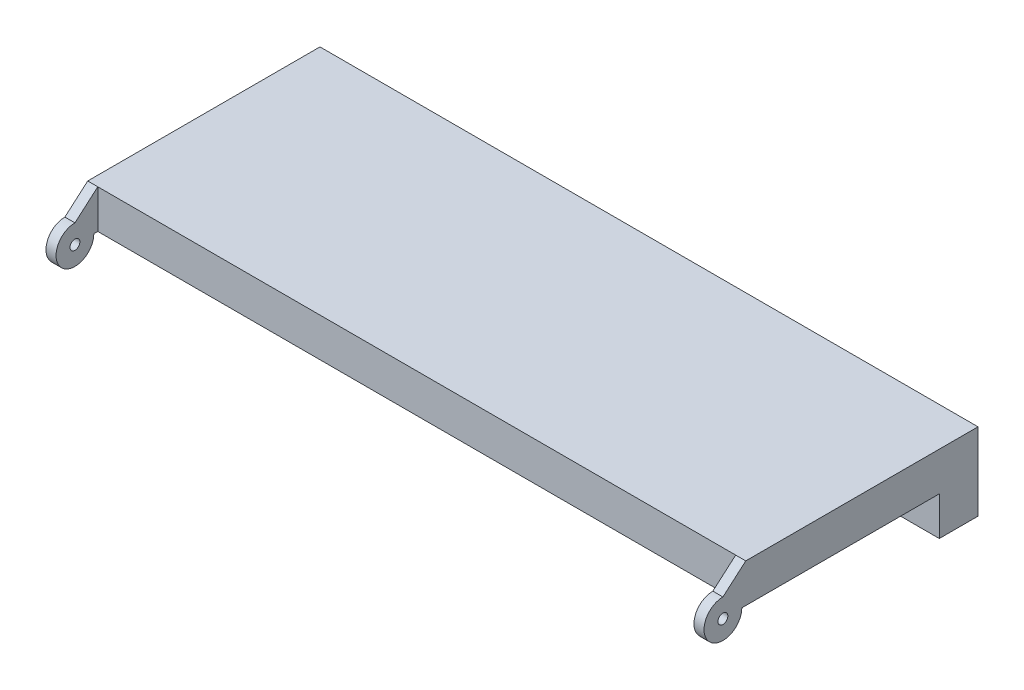
ISO-10303-21;
HEADER;
FILE_DESCRIPTION(('STEP AP214'),'2;1');
FILE_NAME('part.step','',(''),(''),'','','');
FILE_SCHEMA(('AUTOMOTIVE_DESIGN { 1 0 10303 214 1 1 1 1 }'));
ENDSEC;
DATA;
#1=APPLICATION_CONTEXT('core data for automotive mechanical design processes');
#2=APPLICATION_PROTOCOL_DEFINITION('international standard','automotive_design',2000,#1);
#3=PRODUCT_CONTEXT('',#1,'mechanical');
#4=PRODUCT('Part','Part','',(#3));
#5=PRODUCT_RELATED_PRODUCT_CATEGORY('part','',(#4));
#6=PRODUCT_DEFINITION_FORMATION('','',#4);
#7=PRODUCT_DEFINITION_CONTEXT('part definition',#1,'design');
#8=PRODUCT_DEFINITION('design','',#6,#7);
#9=PRODUCT_DEFINITION_SHAPE('','',#8);
#10=(LENGTH_UNIT() NAMED_UNIT(*) SI_UNIT(.MILLI.,.METRE.));
#11=(NAMED_UNIT(*) PLANE_ANGLE_UNIT() SI_UNIT($,.RADIAN.));
#12=(NAMED_UNIT(*) SI_UNIT($,.STERADIAN.) SOLID_ANGLE_UNIT());
#13=UNCERTAINTY_MEASURE_WITH_UNIT(LENGTH_MEASURE(1.E-05),#10,'distance_accuracy_value','');
#14=(GEOMETRIC_REPRESENTATION_CONTEXT(3) GLOBAL_UNCERTAINTY_ASSIGNED_CONTEXT((#13)) GLOBAL_UNIT_ASSIGNED_CONTEXT((#10,
#11,#12)) REPRESENTATION_CONTEXT('',''));
#15=CARTESIAN_POINT('',(0.,0.,0.));
#16=DIRECTION('',(0.,0.,1.));
#17=DIRECTION('',(1.,0.,0.));
#18=AXIS2_PLACEMENT_3D('',#15,#16,#17);
#19=CARTESIAN_POINT('',(0.,10.,0.));
#20=DIRECTION('',(0.,0.,-1.));
#21=DIRECTION('',(-1.,0.,0.));
#22=AXIS2_PLACEMENT_3D('',#19,#20,#21);
#23=PLANE('',#22);
#24=DIRECTION('',(-1.,0.,0.));
#25=VECTOR('',#24,1.);
#26=CARTESIAN_POINT('',(85.,5.,0.));
#27=LINE('',#26,#25);
#28=CARTESIAN_POINT('',(83.7,5.,0.));
#29=VERTEX_POINT('',#28);
#30=CARTESIAN_POINT('',(1.3,5.,0.));
#31=VERTEX_POINT('',#30);
#32=EDGE_CURVE('E60',#29,#31,#27,.T.);
#33=ORIENTED_EDGE('',*,*,#32,.F.);
#34=DIRECTION('',(0.,1.,0.));
#35=VECTOR('',#34,1.);
#36=CARTESIAN_POINT('',(83.7,0.,0.));
#37=LINE('',#36,#35);
#38=CARTESIAN_POINT('',(83.7,10.,0.));
#39=VERTEX_POINT('',#38);
#40=EDGE_CURVE('E158',#29,#39,#37,.T.);
#41=ORIENTED_EDGE('',*,*,#40,.T.);
#42=DIRECTION('',(1.,0.,0.));
#43=VECTOR('',#42,1.);
#44=CARTESIAN_POINT('',(0.,10.,0.));
#45=LINE('',#44,#43);
#46=CARTESIAN_POINT('',(1.3,10.,0.));
#47=VERTEX_POINT('',#46);
#48=EDGE_CURVE('E237',#47,#39,#45,.T.);
#49=ORIENTED_EDGE('',*,*,#48,.F.);
#50=DIRECTION('',(0.,1.,0.));
#51=VECTOR('',#50,1.);
#52=CARTESIAN_POINT('',(1.3,0.,0.));
#53=LINE('',#52,#51);
#54=EDGE_CURVE('E193',#31,#47,#53,.T.);
#55=ORIENTED_EDGE('',*,*,#54,.F.);
#56=EDGE_LOOP('',(#33,#41,#49,#55));
#57=FACE_BOUND('',#56,.T.);
#58=ADVANCED_FACE('F39',(#57),#23,.F.);
#59=CARTESIAN_POINT('',(0.,10.,0.));
#60=DIRECTION('',(1.,0.,0.));
#61=DIRECTION('',(0.,0.,-1.));
#62=AXIS2_PLACEMENT_3D('',#59,#60,#61);
#63=PLANE('',#62);
#64=DIRECTION('',(0.,0.,1.));
#65=VECTOR('',#64,1.);
#66=CARTESIAN_POINT('',(0.,0.,0.));
#67=LINE('',#66,#65);
#68=CARTESIAN_POINT('',(0.,0.,-30.));
#69=VERTEX_POINT('',#68);
#70=CARTESIAN_POINT('',(0.,0.,-25.));
#71=VERTEX_POINT('',#70);
#72=EDGE_CURVE('E229',#69,#71,#67,.T.);
#73=ORIENTED_EDGE('',*,*,#72,.T.);
#74=DIRECTION('',(0.,-1.,0.));
#75=VECTOR('',#74,1.);
#76=CARTESIAN_POINT('',(0.,0.,-25.));
#77=LINE('',#76,#75);
#78=CARTESIAN_POINT('',(0.,5.,-25.));
#79=VERTEX_POINT('',#78);
#80=EDGE_CURVE('E134',#79,#71,#77,.T.);
#81=ORIENTED_EDGE('',*,*,#80,.F.);
#82=DIRECTION('',(0.,0.,-1.));
#83=VECTOR('',#82,1.);
#84=CARTESIAN_POINT('',(0.,5.,0.));
#85=LINE('',#84,#83);
#86=CARTESIAN_POINT('',(0.,5.,0.51));
#87=VERTEX_POINT('',#86);
#88=EDGE_CURVE('E215',#87,#79,#85,.T.);
#89=ORIENTED_EDGE('',*,*,#88,.F.);
#90=CARTESIAN_POINT('',(0.,5.,2.95));
#91=DIRECTION('',(-1.,0.,0.));
#92=DIRECTION('',(0.,0.,1.));
#93=AXIS2_PLACEMENT_3D('',#90,#91,#92);
#94=CIRCLE('',#93,2.44);
#95=CARTESIAN_POINT('',(0.,7.44,2.95));
#96=VERTEX_POINT('',#95);
#97=EDGE_CURVE('E178',#87,#96,#94,.T.);
#98=ORIENTED_EDGE('',*,*,#97,.T.);
#99=DIRECTION('',(0.,0.655417754811199,-0.755266553395718));
#100=VECTOR('',#99,1.);
#101=CARTESIAN_POINT('',(0.,5.70427566678247,4.95015108710614));
#102=LINE('',#101,#100);
#103=CARTESIAN_POINT('',(0.,10.,0.));
#104=VERTEX_POINT('',#103);
#105=EDGE_CURVE('E205',#96,#104,#102,.T.);
#106=ORIENTED_EDGE('',*,*,#105,.T.);
#107=DIRECTION('',(0.,0.,1.));
#108=VECTOR('',#107,1.);
#109=CARTESIAN_POINT('',(0.,10.,0.));
#110=LINE('',#109,#108);
#111=CARTESIAN_POINT('',(0.,10.,-30.));
#112=VERTEX_POINT('',#111);
#113=EDGE_CURVE('E234',#112,#104,#110,.T.);
#114=ORIENTED_EDGE('',*,*,#113,.F.);
#115=DIRECTION('',(0.,-1.,0.));
#116=VECTOR('',#115,1.);
#117=CARTESIAN_POINT('',(0.,10.,-30.));
#118=LINE('',#117,#116);
#119=EDGE_CURVE('E48',#112,#69,#118,.T.);
#120=ORIENTED_EDGE('',*,*,#119,.T.);
#121=EDGE_LOOP('',(#73,#81,#89,#98,#106,#114,#120));
#122=FACE_BOUND('',#121,.T.);
#123=CARTESIAN_POINT('',(0.,5.,2.95));
#124=DIRECTION('',(-1.,0.,0.));
#125=DIRECTION('',(0.,0.,1.));
#126=AXIS2_PLACEMENT_3D('',#123,#124,#125);
#127=CIRCLE('',#126,0.64);
#128=CARTESIAN_POINT('',(0.,5.,3.59));
#129=VERTEX_POINT('',#128);
#130=EDGE_CURVE('E185',#129,#129,#127,.T.);
#131=ORIENTED_EDGE('',*,*,#130,.F.);
#132=EDGE_LOOP('',(#131));
#133=FACE_BOUND('',#132,.T.);
#134=ADVANCED_FACE('F41',(#122,#133),#63,.F.);
#135=CARTESIAN_POINT('',(85.,10.,0.));
#136=DIRECTION('',(-1.,0.,0.));
#137=DIRECTION('',(0.,0.,1.));
#138=AXIS2_PLACEMENT_3D('',#135,#136,#137);
#139=PLANE('',#138);
#140=DIRECTION('',(0.,0.,-1.));
#141=VECTOR('',#140,1.);
#142=CARTESIAN_POINT('',(85.,5.,0.));
#143=LINE('',#142,#141);
#144=CARTESIAN_POINT('',(85.,5.,0.51));
#145=VERTEX_POINT('',#144);
#146=CARTESIAN_POINT('',(85.,5.,-25.));
#147=VERTEX_POINT('',#146);
#148=EDGE_CURVE('E121',#145,#147,#143,.T.);
#149=ORIENTED_EDGE('',*,*,#148,.T.);
#150=DIRECTION('',(0.,-1.,0.));
#151=VECTOR('',#150,1.);
#152=CARTESIAN_POINT('',(85.,0.,-25.));
#153=LINE('',#152,#151);
#154=CARTESIAN_POINT('',(85.,0.,-25.));
#155=VERTEX_POINT('',#154);
#156=EDGE_CURVE('E133',#147,#155,#153,.T.);
#157=ORIENTED_EDGE('',*,*,#156,.T.);
#158=DIRECTION('',(0.,0.,-1.));
#159=VECTOR('',#158,1.);
#160=CARTESIAN_POINT('',(85.,0.,0.));
#161=LINE('',#160,#159);
#162=CARTESIAN_POINT('',(85.,0.,-30.));
#163=VERTEX_POINT('',#162);
#164=EDGE_CURVE('E251',#155,#163,#161,.T.);
#165=ORIENTED_EDGE('',*,*,#164,.T.);
#166=DIRECTION('',(0.,-1.,0.));
#167=VECTOR('',#166,1.);
#168=CARTESIAN_POINT('',(85.,10.,-30.));
#169=LINE('',#168,#167);
#170=CARTESIAN_POINT('',(85.,10.,-30.));
#171=VERTEX_POINT('',#170);
#172=EDGE_CURVE('E11',#171,#163,#169,.T.);
#173=ORIENTED_EDGE('',*,*,#172,.F.);
#174=DIRECTION('',(0.,0.,-1.));
#175=VECTOR('',#174,1.);
#176=CARTESIAN_POINT('',(85.,10.,0.));
#177=LINE('',#176,#175);
#178=CARTESIAN_POINT('',(85.,10.,0.));
#179=VERTEX_POINT('',#178);
#180=EDGE_CURVE('E242',#179,#171,#177,.T.);
#181=ORIENTED_EDGE('',*,*,#180,.F.);
#182=DIRECTION('',(0.,0.655417754811199,-0.755266553395718));
#183=VECTOR('',#182,1.);
#184=CARTESIAN_POINT('',(85.,5.70427566678247,4.95015108710614));
#185=LINE('',#184,#183);
#186=CARTESIAN_POINT('',(85.,7.44,2.95));
#187=VERTEX_POINT('',#186);
#188=EDGE_CURVE('E150',#187,#179,#185,.T.);
#189=ORIENTED_EDGE('',*,*,#188,.F.);
#190=CARTESIAN_POINT('',(85.,5.,2.95));
#191=DIRECTION('',(-1.,0.,0.));
#192=DIRECTION('',(0.,0.,1.));
#193=AXIS2_PLACEMENT_3D('',#190,#191,#192);
#194=CIRCLE('',#193,2.44);
#195=EDGE_CURVE('E139',#145,#187,#194,.T.);
#196=ORIENTED_EDGE('',*,*,#195,.F.);
#197=EDGE_LOOP('',(#149,#157,#165,#173,#181,#189,#196));
#198=FACE_BOUND('',#197,.T.);
#199=CARTESIAN_POINT('',(85.,5.,2.95));
#200=DIRECTION('',(-1.,0.,0.));
#201=DIRECTION('',(0.,0.,1.));
#202=AXIS2_PLACEMENT_3D('',#199,#200,#201);
#203=CIRCLE('',#202,0.64);
#204=CARTESIAN_POINT('',(85.,5.,3.59));
#205=VERTEX_POINT('',#204);
#206=EDGE_CURVE('E144',#205,#205,#203,.T.);
#207=ORIENTED_EDGE('',*,*,#206,.T.);
#208=EDGE_LOOP('',(#207));
#209=FACE_BOUND('',#208,.T.);
#210=ADVANCED_FACE('F147',(#198,#209),#139,.F.);
#211=CARTESIAN_POINT('',(0.,10.,-30.));
#212=DIRECTION('',(0.,0.,1.));
#213=DIRECTION('',(1.,0.,0.));
#214=AXIS2_PLACEMENT_3D('',#211,#212,#213);
#215=PLANE('',#214);
#216=DIRECTION('',(-1.,0.,0.));
#217=VECTOR('',#216,1.);
#218=CARTESIAN_POINT('',(0.,0.,-30.));
#219=LINE('',#218,#217);
#220=EDGE_CURVE('E238',#163,#69,#219,.T.);
#221=ORIENTED_EDGE('',*,*,#220,.T.);
#222=ORIENTED_EDGE('',*,*,#119,.F.);
#223=DIRECTION('',(-1.,0.,0.));
#224=VECTOR('',#223,1.);
#225=CARTESIAN_POINT('',(0.,10.,-30.));
#226=LINE('',#225,#224);
#227=EDGE_CURVE('E245',#171,#112,#226,.T.);
#228=ORIENTED_EDGE('',*,*,#227,.F.);
#229=ORIENTED_EDGE('',*,*,#172,.T.);
#230=EDGE_LOOP('',(#221,#222,#228,#229));
#231=FACE_BOUND('',#230,.T.);
#232=ADVANCED_FACE('F272',(#231),#215,.F.);
#233=CARTESIAN_POINT('',(0.,10.,0.));
#234=DIRECTION('',(0.,-1.,0.));
#235=DIRECTION('',(0.,0.,-1.));
#236=AXIS2_PLACEMENT_3D('',#233,#234,#235);
#237=PLANE('',#236);
#238=ORIENTED_EDGE('',*,*,#113,.T.);
#239=EDGE_CURVE('E239',#104,#47,#45,.T.);
#240=ORIENTED_EDGE('',*,*,#239,.T.);
#241=ORIENTED_EDGE('',*,*,#48,.T.);
#242=DIRECTION('',(-1.,0.,0.));
#243=VECTOR('',#242,1.);
#244=CARTESIAN_POINT('',(85.,10.,0.));
#245=LINE('',#244,#243);
#246=EDGE_CURVE('E175',#179,#39,#245,.T.);
#247=ORIENTED_EDGE('',*,*,#246,.F.);
#248=ORIENTED_EDGE('',*,*,#180,.T.);
#249=ORIENTED_EDGE('',*,*,#227,.T.);
#250=EDGE_LOOP('',(#238,#240,#241,#247,#248,#249));
#251=FACE_BOUND('',#250,.T.);
#252=ADVANCED_FACE('F274',(#251),#237,.F.);
#253=CARTESIAN_POINT('',(0.,0.,0.));
#254=DIRECTION('',(0.,-1.,0.));
#255=DIRECTION('',(0.,0.,-1.));
#256=AXIS2_PLACEMENT_3D('',#253,#254,#255);
#257=PLANE('',#256);
#258=DIRECTION('',(-1.,0.,0.));
#259=VECTOR('',#258,1.);
#260=CARTESIAN_POINT('',(85.,0.,-25.));
#261=LINE('',#260,#259);
#262=EDGE_CURVE('E225',#155,#71,#261,.T.);
#263=ORIENTED_EDGE('',*,*,#262,.T.);
#264=ORIENTED_EDGE('',*,*,#72,.F.);
#265=ORIENTED_EDGE('',*,*,#220,.F.);
#266=ORIENTED_EDGE('',*,*,#164,.F.);
#267=EDGE_LOOP('',(#263,#264,#265,#266));
#268=FACE_BOUND('',#267,.T.);
#269=ADVANCED_FACE('F267',(#268),#257,.T.);
#270=CARTESIAN_POINT('',(85.,0.,-25.));
#271=DIRECTION('',(0.,0.,-1.));
#272=DIRECTION('',(-1.,0.,0.));
#273=AXIS2_PLACEMENT_3D('',#270,#271,#272);
#274=PLANE('',#273);
#275=ORIENTED_EDGE('',*,*,#80,.T.);
#276=ORIENTED_EDGE('',*,*,#262,.F.);
#277=ORIENTED_EDGE('',*,*,#156,.F.);
#278=DIRECTION('',(-1.,0.,0.));
#279=VECTOR('',#278,1.);
#280=CARTESIAN_POINT('',(85.,5.,-25.));
#281=LINE('',#280,#279);
#282=EDGE_CURVE('E127',#147,#79,#281,.T.);
#283=ORIENTED_EDGE('',*,*,#282,.T.);
#284=EDGE_LOOP('',(#275,#276,#277,#283));
#285=FACE_BOUND('',#284,.T.);
#286=ADVANCED_FACE('F270',(#285),#274,.F.);
#287=CARTESIAN_POINT('',(85.,5.,0.));
#288=DIRECTION('',(0.,1.,0.));
#289=DIRECTION('',(0.,0.,1.));
#290=AXIS2_PLACEMENT_3D('',#287,#288,#289);
#291=PLANE('',#290);
#292=ORIENTED_EDGE('',*,*,#88,.T.);
#293=ORIENTED_EDGE('',*,*,#282,.F.);
#294=ORIENTED_EDGE('',*,*,#148,.F.);
#295=DIRECTION('',(-1.,0.,0.));
#296=VECTOR('',#295,1.);
#297=CARTESIAN_POINT('',(85.,5.,0.51));
#298=LINE('',#297,#296);
#299=CARTESIAN_POINT('',(83.7,5.,0.51));
#300=VERTEX_POINT('',#299);
#301=EDGE_CURVE('E125',#145,#300,#298,.T.);
#302=ORIENTED_EDGE('',*,*,#301,.T.);
#303=DIRECTION('',(0.,0.,1.));
#304=VECTOR('',#303,1.);
#305=CARTESIAN_POINT('',(83.7,5.,0.));
#306=LINE('',#305,#304);
#307=EDGE_CURVE('E55',#29,#300,#306,.T.);
#308=ORIENTED_EDGE('',*,*,#307,.F.);
#309=ORIENTED_EDGE('',*,*,#32,.T.);
#310=DIRECTION('',(0.,0.,1.));
#311=VECTOR('',#310,1.);
#312=CARTESIAN_POINT('',(1.3,5.,0.));
#313=LINE('',#312,#311);
#314=CARTESIAN_POINT('',(1.3,5.,0.51));
#315=VERTEX_POINT('',#314);
#316=EDGE_CURVE('E181',#31,#315,#313,.T.);
#317=ORIENTED_EDGE('',*,*,#316,.T.);
#318=DIRECTION('',(-1.,0.,0.));
#319=VECTOR('',#318,1.);
#320=CARTESIAN_POINT('',(1.3,5.,0.51));
#321=LINE('',#320,#319);
#322=EDGE_CURVE('E201',#315,#87,#321,.T.);
#323=ORIENTED_EDGE('',*,*,#322,.T.);
#324=EDGE_LOOP('',(#292,#293,#294,#302,#308,#309,#317,#323));
#325=FACE_BOUND('',#324,.T.);
#326=ADVANCED_FACE('F124',(#325),#291,.F.);
#327=CARTESIAN_POINT('',(1.3,5.70427566678247,4.95015108710614));
#328=DIRECTION('',(0.,0.755266553395718,0.655417754811199));
#329=DIRECTION('',(0.,-0.655417754811199,0.755266553395718));
#330=AXIS2_PLACEMENT_3D('',#327,#328,#329);
#331=PLANE('',#330);
#332=ORIENTED_EDGE('',*,*,#105,.F.);
#333=DIRECTION('',(-1.,0.,0.));
#334=VECTOR('',#333,1.);
#335=CARTESIAN_POINT('',(1.3,7.44,2.95));
#336=LINE('',#335,#334);
#337=CARTESIAN_POINT('',(1.3,7.44,2.95));
#338=VERTEX_POINT('',#337);
#339=EDGE_CURVE('E212',#338,#96,#336,.T.);
#340=ORIENTED_EDGE('',*,*,#339,.F.);
#341=DIRECTION('',(0.,0.655417754811199,-0.755266553395718));
#342=VECTOR('',#341,1.);
#343=CARTESIAN_POINT('',(1.3,5.70427566678247,4.95015108710614));
#344=LINE('',#343,#342);
#345=EDGE_CURVE('E189',#338,#47,#344,.T.);
#346=ORIENTED_EDGE('',*,*,#345,.T.);
#347=ORIENTED_EDGE('',*,*,#239,.F.);
#348=EDGE_LOOP('',(#332,#340,#346,#347));
#349=FACE_BOUND('',#348,.T.);
#350=ADVANCED_FACE('F297',(#349),#331,.T.);
#351=CARTESIAN_POINT('',(1.3,5.,2.95));
#352=DIRECTION('',(-1.,0.,0.));
#353=DIRECTION('',(0.,0.,1.));
#354=AXIS2_PLACEMENT_3D('',#351,#352,#353);
#355=CYLINDRICAL_SURFACE('',#354,2.44);
#356=ORIENTED_EDGE('',*,*,#97,.F.);
#357=ORIENTED_EDGE('',*,*,#322,.F.);
#358=CARTESIAN_POINT('',(1.3,5.,2.95));
#359=DIRECTION('',(-1.,0.,0.));
#360=DIRECTION('',(0.,0.,1.));
#361=AXIS2_PLACEMENT_3D('',#358,#359,#360);
#362=CIRCLE('',#361,2.44);
#363=EDGE_CURVE('E184',#315,#338,#362,.T.);
#364=ORIENTED_EDGE('',*,*,#363,.T.);
#365=ORIENTED_EDGE('',*,*,#339,.T.);
#366=EDGE_LOOP('',(#356,#357,#364,#365));
#367=FACE_BOUND('',#366,.T.);
#368=ADVANCED_FACE('F294',(#367),#355,.T.);
#369=CARTESIAN_POINT('',(1.3,5.,2.95));
#370=DIRECTION('',(-1.,0.,0.));
#371=DIRECTION('',(0.,0.,1.));
#372=AXIS2_PLACEMENT_3D('',#369,#370,#371);
#373=CYLINDRICAL_SURFACE('',#372,0.64);
#374=CARTESIAN_POINT('',(1.3,5.,2.95));
#375=DIRECTION('',(-1.,0.,0.));
#376=DIRECTION('',(0.,0.,1.));
#377=AXIS2_PLACEMENT_3D('',#374,#375,#376);
#378=CIRCLE('',#377,0.64);
#379=CARTESIAN_POINT('',(1.3,5.,3.59));
#380=VERTEX_POINT('',#379);
#381=EDGE_CURVE('E197',#380,#380,#378,.T.);
#382=ORIENTED_EDGE('',*,*,#381,.F.);
#383=EDGE_LOOP('',(#382));
#384=FACE_BOUND('',#383,.T.);
#385=ORIENTED_EDGE('',*,*,#130,.T.);
#386=EDGE_LOOP('',(#385));
#387=FACE_BOUND('',#386,.T.);
#388=ADVANCED_FACE('F304',(#384,#387),#373,.F.);
#389=CARTESIAN_POINT('',(1.3,0.,0.));
#390=DIRECTION('',(-1.,0.,0.));
#391=DIRECTION('',(0.,0.,1.));
#392=AXIS2_PLACEMENT_3D('',#389,#390,#391);
#393=PLANE('',#392);
#394=ORIENTED_EDGE('',*,*,#316,.F.);
#395=ORIENTED_EDGE('',*,*,#54,.T.);
#396=ORIENTED_EDGE('',*,*,#345,.F.);
#397=ORIENTED_EDGE('',*,*,#363,.F.);
#398=EDGE_LOOP('',(#394,#395,#396,#397));
#399=FACE_BOUND('',#398,.T.);
#400=ORIENTED_EDGE('',*,*,#381,.T.);
#401=EDGE_LOOP('',(#400));
#402=FACE_BOUND('',#401,.T.);
#403=ADVANCED_FACE('F290',(#399,#402),#393,.F.);
#404=CARTESIAN_POINT('',(85.,5.70427566678247,4.95015108710614));
#405=DIRECTION('',(0.,0.755266553395718,0.655417754811199));
#406=DIRECTION('',(0.,-0.655417754811199,0.755266553395718));
#407=AXIS2_PLACEMENT_3D('',#404,#405,#406);
#408=PLANE('',#407);
#409=DIRECTION('',(0.,0.655417754811199,-0.755266553395718));
#410=VECTOR('',#409,1.);
#411=CARTESIAN_POINT('',(83.7,5.70427566678247,4.95015108710614));
#412=LINE('',#411,#410);
#413=CARTESIAN_POINT('',(83.7,7.44,2.95));
#414=VERTEX_POINT('',#413);
#415=EDGE_CURVE('E168',#414,#39,#412,.T.);
#416=ORIENTED_EDGE('',*,*,#415,.F.);
#417=DIRECTION('',(-1.,0.,0.));
#418=VECTOR('',#417,1.);
#419=CARTESIAN_POINT('',(85.,7.44,2.95));
#420=LINE('',#419,#418);
#421=EDGE_CURVE('E143',#187,#414,#420,.T.);
#422=ORIENTED_EDGE('',*,*,#421,.F.);
#423=ORIENTED_EDGE('',*,*,#188,.T.);
#424=ORIENTED_EDGE('',*,*,#246,.T.);
#425=EDGE_LOOP('',(#416,#422,#423,#424));
#426=FACE_BOUND('',#425,.T.);
#427=ADVANCED_FACE('F281',(#426),#408,.T.);
#428=CARTESIAN_POINT('',(85.,5.,2.95));
#429=DIRECTION('',(-1.,0.,0.));
#430=DIRECTION('',(0.,0.,1.));
#431=AXIS2_PLACEMENT_3D('',#428,#429,#430);
#432=CYLINDRICAL_SURFACE('',#431,2.44);
#433=CARTESIAN_POINT('',(83.7,5.,2.95));
#434=DIRECTION('',(-1.,0.,0.));
#435=DIRECTION('',(0.,0.,1.));
#436=AXIS2_PLACEMENT_3D('',#433,#434,#435);
#437=CIRCLE('',#436,2.44);
#438=EDGE_CURVE('E141',#300,#414,#437,.T.);
#439=ORIENTED_EDGE('',*,*,#438,.F.);
#440=ORIENTED_EDGE('',*,*,#301,.F.);
#441=ORIENTED_EDGE('',*,*,#195,.T.);
#442=ORIENTED_EDGE('',*,*,#421,.T.);
#443=EDGE_LOOP('',(#439,#440,#441,#442));
#444=FACE_BOUND('',#443,.T.);
#445=ADVANCED_FACE('F138',(#444),#432,.T.);
#446=CARTESIAN_POINT('',(85.,5.,2.95));
#447=DIRECTION('',(-1.,0.,0.));
#448=DIRECTION('',(0.,0.,1.));
#449=AXIS2_PLACEMENT_3D('',#446,#447,#448);
#450=CYLINDRICAL_SURFACE('',#449,0.64);
#451=ORIENTED_EDGE('',*,*,#206,.F.);
#452=EDGE_LOOP('',(#451));
#453=FACE_BOUND('',#452,.T.);
#454=CARTESIAN_POINT('',(83.7,5.,2.95));
#455=DIRECTION('',(-1.,0.,0.));
#456=DIRECTION('',(0.,0.,1.));
#457=AXIS2_PLACEMENT_3D('',#454,#455,#456);
#458=CIRCLE('',#457,0.64);
#459=CARTESIAN_POINT('',(83.7,5.,3.59));
#460=VERTEX_POINT('',#459);
#461=EDGE_CURVE('E152',#460,#460,#458,.T.);
#462=ORIENTED_EDGE('',*,*,#461,.T.);
#463=EDGE_LOOP('',(#462));
#464=FACE_BOUND('',#463,.T.);
#465=ADVANCED_FACE('F354',(#453,#464),#450,.F.);
#466=CARTESIAN_POINT('',(83.7,0.,0.));
#467=DIRECTION('',(-1.,0.,0.));
#468=DIRECTION('',(0.,0.,1.));
#469=AXIS2_PLACEMENT_3D('',#466,#467,#468);
#470=PLANE('',#469);
#471=ORIENTED_EDGE('',*,*,#307,.T.);
#472=ORIENTED_EDGE('',*,*,#438,.T.);
#473=ORIENTED_EDGE('',*,*,#415,.T.);
#474=ORIENTED_EDGE('',*,*,#40,.F.);
#475=EDGE_LOOP('',(#471,#472,#473,#474));
#476=FACE_BOUND('',#475,.T.);
#477=ORIENTED_EDGE('',*,*,#461,.F.);
#478=EDGE_LOOP('',(#477));
#479=FACE_BOUND('',#478,.T.);
#480=ADVANCED_FACE('F283',(#476,#479),#470,.T.);
#481=CLOSED_SHELL('',(#58,#134,#210,#232,#252,#269,#286,#326,#350,#368,#388,#403,#427,#445,#465,#480));
#482=MANIFOLD_SOLID_BREP('B2',#481);
#483=ADVANCED_BREP_SHAPE_REPRESENTATION('',(#18,#482),#14);
#484=SHAPE_DEFINITION_REPRESENTATION(#9,#483);
ENDSEC;
END-ISO-10303-21;
